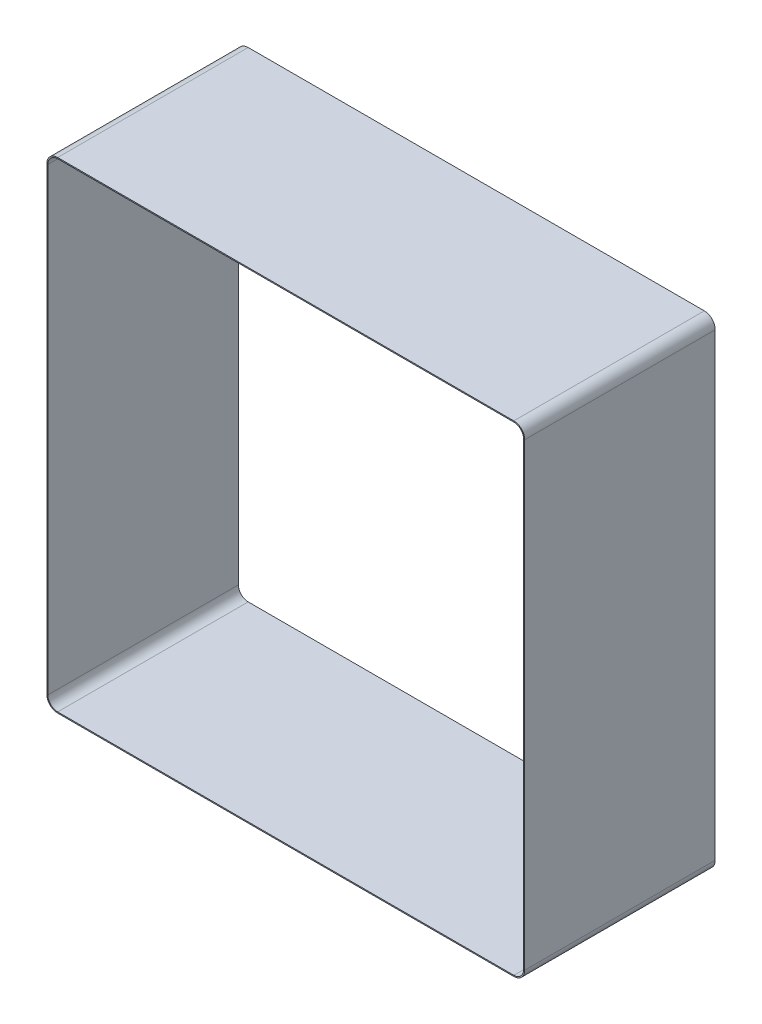
ISO-10303-21;
HEADER;
FILE_DESCRIPTION(('STEP AP214'),'2;1');
FILE_NAME('part.step','',(''),(''),'','','');
FILE_SCHEMA(('AUTOMOTIVE_DESIGN { 1 0 10303 214 1 1 1 1 }'));
ENDSEC;
DATA;
#1=APPLICATION_CONTEXT('core data for automotive mechanical design processes');
#2=APPLICATION_PROTOCOL_DEFINITION('international standard','automotive_design',2000,#1);
#3=PRODUCT_CONTEXT('',#1,'mechanical');
#4=PRODUCT('Part','Part','',(#3));
#5=PRODUCT_RELATED_PRODUCT_CATEGORY('part','',(#4));
#6=PRODUCT_DEFINITION_FORMATION('','',#4);
#7=PRODUCT_DEFINITION_CONTEXT('part definition',#1,'design');
#8=PRODUCT_DEFINITION('design','',#6,#7);
#9=PRODUCT_DEFINITION_SHAPE('','',#8);
#10=(LENGTH_UNIT() NAMED_UNIT(*) SI_UNIT(.MILLI.,.METRE.));
#11=(NAMED_UNIT(*) PLANE_ANGLE_UNIT() SI_UNIT($,.RADIAN.));
#12=(NAMED_UNIT(*) SI_UNIT($,.STERADIAN.) SOLID_ANGLE_UNIT());
#13=UNCERTAINTY_MEASURE_WITH_UNIT(LENGTH_MEASURE(1.E-05),#10,'distance_accuracy_value','');
#14=(GEOMETRIC_REPRESENTATION_CONTEXT(3) GLOBAL_UNCERTAINTY_ASSIGNED_CONTEXT((#13)) GLOBAL_UNIT_ASSIGNED_CONTEXT((#10,
#11,#12)) REPRESENTATION_CONTEXT('',''));
#15=CARTESIAN_POINT('',(0.,0.,0.));
#16=DIRECTION('',(0.,0.,1.));
#17=DIRECTION('',(1.,0.,0.));
#18=AXIS2_PLACEMENT_3D('',#15,#16,#17);
#19=CARTESIAN_POINT('',(-53.213,-53.594,44.45));
#20=DIRECTION('',(0.,0.,1.));
#21=DIRECTION('',(1.,0.,0.));
#22=AXIS2_PLACEMENT_3D('',#19,#20,#21);
#23=PLANE('',#22);
#24=CARTESIAN_POINT('',(-53.213,-53.594,44.45));
#25=DIRECTION('',(0.,0.,1.));
#26=DIRECTION('',(1.,0.,0.));
#27=AXIS2_PLACEMENT_3D('',#24,#25,#26);
#28=CIRCLE('',#27,2.54);
#29=CARTESIAN_POINT('',(-55.753,-53.594,44.45));
#30=VERTEX_POINT('',#29);
#31=CARTESIAN_POINT('',(-53.213,-56.134,44.45));
#32=VERTEX_POINT('',#31);
#33=EDGE_CURVE('E211',#30,#32,#28,.T.);
#34=ORIENTED_EDGE('',*,*,#33,.T.);
#35=DIRECTION('',(1.,0.,0.));
#36=VECTOR('',#35,1.);
#37=CARTESIAN_POINT('',(-53.213,-56.134,44.45));
#38=LINE('',#37,#36);
#39=CARTESIAN_POINT('',(53.213,-56.134,44.45));
#40=VERTEX_POINT('',#39);
#41=EDGE_CURVE('E214',#32,#40,#38,.T.);
#42=ORIENTED_EDGE('',*,*,#41,.T.);
#43=CARTESIAN_POINT('',(53.213,-53.594,44.45));
#44=DIRECTION('',(0.,0.,1.));
#45=DIRECTION('',(-1.,0.,0.));
#46=AXIS2_PLACEMENT_3D('',#43,#44,#45);
#47=CIRCLE('',#46,2.54);
#48=CARTESIAN_POINT('',(55.753,-53.594,44.45));
#49=VERTEX_POINT('',#48);
#50=EDGE_CURVE('E217',#40,#49,#47,.T.);
#51=ORIENTED_EDGE('',*,*,#50,.T.);
#52=DIRECTION('',(0.,1.,0.));
#53=VECTOR('',#52,1.);
#54=CARTESIAN_POINT('',(55.753,53.594,44.45));
#55=LINE('',#54,#53);
#56=CARTESIAN_POINT('',(55.753,53.594,44.45));
#57=VERTEX_POINT('',#56);
#58=EDGE_CURVE('E219',#49,#57,#55,.T.);
#59=ORIENTED_EDGE('',*,*,#58,.T.);
#60=CARTESIAN_POINT('',(53.213,53.594,44.45));
#61=DIRECTION('',(0.,0.,1.));
#62=DIRECTION('',(1.,0.,0.));
#63=AXIS2_PLACEMENT_3D('',#60,#61,#62);
#64=CIRCLE('',#63,2.54);
#65=CARTESIAN_POINT('',(53.213,56.134,44.45));
#66=VERTEX_POINT('',#65);
#67=EDGE_CURVE('E221',#57,#66,#64,.T.);
#68=ORIENTED_EDGE('',*,*,#67,.T.);
#69=DIRECTION('',(-1.,0.,0.));
#70=VECTOR('',#69,1.);
#71=CARTESIAN_POINT('',(-53.213,56.134,44.45));
#72=LINE('',#71,#70);
#73=CARTESIAN_POINT('',(-53.213,56.134,44.45));
#74=VERTEX_POINT('',#73);
#75=EDGE_CURVE('E223',#66,#74,#72,.T.);
#76=ORIENTED_EDGE('',*,*,#75,.T.);
#77=CARTESIAN_POINT('',(-53.213,53.594,44.45));
#78=DIRECTION('',(0.,0.,1.));
#79=DIRECTION('',(1.,0.,0.));
#80=AXIS2_PLACEMENT_3D('',#77,#78,#79);
#81=CIRCLE('',#80,2.54);
#82=CARTESIAN_POINT('',(-55.753,53.594,44.45));
#83=VERTEX_POINT('',#82);
#84=EDGE_CURVE('E225',#74,#83,#81,.T.);
#85=ORIENTED_EDGE('',*,*,#84,.T.);
#86=DIRECTION('',(0.,-1.,0.));
#87=VECTOR('',#86,1.);
#88=CARTESIAN_POINT('',(-55.753,53.594,44.45));
#89=LINE('',#88,#87);
#90=EDGE_CURVE('E227',#83,#30,#89,.T.);
#91=ORIENTED_EDGE('',*,*,#90,.T.);
#92=EDGE_LOOP('',(#34,#42,#51,#59,#68,#76,#85,#91));
#93=FACE_BOUND('',#92,.T.);
#94=DIRECTION('',(0.,-1.,0.));
#95=VECTOR('',#94,1.);
#96=CARTESIAN_POINT('',(-55.499,53.594,44.45));
#97=LINE('',#96,#95);
#98=CARTESIAN_POINT('',(-55.499,53.594,44.45));
#99=VERTEX_POINT('',#98);
#100=CARTESIAN_POINT('',(-55.499,-53.594,44.45));
#101=VERTEX_POINT('',#100);
#102=EDGE_CURVE('E154',#99,#101,#97,.T.);
#103=ORIENTED_EDGE('',*,*,#102,.F.);
#104=CARTESIAN_POINT('',(-53.213,53.594,44.45));
#105=DIRECTION('',(0.,0.,1.));
#106=DIRECTION('',(1.,0.,0.));
#107=AXIS2_PLACEMENT_3D('',#104,#105,#106);
#108=CIRCLE('',#107,2.286);
#109=CARTESIAN_POINT('',(-53.213,55.88,44.45));
#110=VERTEX_POINT('',#109);
#111=EDGE_CURVE('E146',#110,#99,#108,.T.);
#112=ORIENTED_EDGE('',*,*,#111,.F.);
#113=DIRECTION('',(-1.,0.,0.));
#114=VECTOR('',#113,1.);
#115=CARTESIAN_POINT('',(-53.213,55.88,44.45));
#116=LINE('',#115,#114);
#117=CARTESIAN_POINT('',(53.213,55.88,44.45));
#118=VERTEX_POINT('',#117);
#119=EDGE_CURVE('E179',#118,#110,#116,.T.);
#120=ORIENTED_EDGE('',*,*,#119,.F.);
#121=CARTESIAN_POINT('',(53.213,53.594,44.45));
#122=DIRECTION('',(0.,0.,1.));
#123=DIRECTION('',(1.,0.,0.));
#124=AXIS2_PLACEMENT_3D('',#121,#122,#123);
#125=CIRCLE('',#124,2.28600000000001);
#126=CARTESIAN_POINT('',(55.499,53.594,44.45));
#127=VERTEX_POINT('',#126);
#128=EDGE_CURVE('E177',#127,#118,#125,.T.);
#129=ORIENTED_EDGE('',*,*,#128,.F.);
#130=DIRECTION('',(0.,1.,0.));
#131=VECTOR('',#130,1.);
#132=CARTESIAN_POINT('',(55.499,53.594,44.45));
#133=LINE('',#132,#131);
#134=CARTESIAN_POINT('',(55.499,-53.594,44.45));
#135=VERTEX_POINT('',#134);
#136=EDGE_CURVE('E175',#135,#127,#133,.T.);
#137=ORIENTED_EDGE('',*,*,#136,.F.);
#138=CARTESIAN_POINT('',(53.213,-53.594,44.45));
#139=DIRECTION('',(0.,0.,1.));
#140=DIRECTION('',(-1.,0.,0.));
#141=AXIS2_PLACEMENT_3D('',#138,#139,#140);
#142=CIRCLE('',#141,2.286);
#143=CARTESIAN_POINT('',(53.213,-55.88,44.45));
#144=VERTEX_POINT('',#143);
#145=EDGE_CURVE('E173',#144,#135,#142,.T.);
#146=ORIENTED_EDGE('',*,*,#145,.F.);
#147=DIRECTION('',(1.,0.,0.));
#148=VECTOR('',#147,1.);
#149=CARTESIAN_POINT('',(-53.213,-55.88,44.45));
#150=LINE('',#149,#148);
#151=CARTESIAN_POINT('',(-53.213,-55.88,44.45));
#152=VERTEX_POINT('',#151);
#153=EDGE_CURVE('E169',#152,#144,#150,.T.);
#154=ORIENTED_EDGE('',*,*,#153,.F.);
#155=CARTESIAN_POINT('',(-53.213,-53.594,44.45));
#156=DIRECTION('',(0.,0.,1.));
#157=DIRECTION('',(1.,0.,0.));
#158=AXIS2_PLACEMENT_3D('',#155,#156,#157);
#159=CIRCLE('',#158,2.286);
#160=EDGE_CURVE('E167',#101,#152,#159,.T.);
#161=ORIENTED_EDGE('',*,*,#160,.F.);
#162=EDGE_LOOP('',(#103,#112,#120,#129,#137,#146,#154,#161));
#163=FACE_BOUND('',#162,.T.);
#164=ADVANCED_FACE('F33',(#93,#163),#23,.T.);
#165=CARTESIAN_POINT('',(-53.213,-53.594,0.));
#166=DIRECTION('',(0.,0.,1.));
#167=DIRECTION('',(1.,0.,0.));
#168=AXIS2_PLACEMENT_3D('',#165,#166,#167);
#169=PLANE('',#168);
#170=CARTESIAN_POINT('',(-53.213,-53.594,0.));
#171=DIRECTION('',(0.,0.,1.));
#172=DIRECTION('',(1.,0.,0.));
#173=AXIS2_PLACEMENT_3D('',#170,#171,#172);
#174=CIRCLE('',#173,2.54);
#175=CARTESIAN_POINT('',(-55.753,-53.594,0.));
#176=VERTEX_POINT('',#175);
#177=CARTESIAN_POINT('',(-53.213,-56.134,0.));
#178=VERTEX_POINT('',#177);
#179=EDGE_CURVE('E162',#176,#178,#174,.T.);
#180=ORIENTED_EDGE('',*,*,#179,.F.);
#181=DIRECTION('',(0.,-1.,0.));
#182=VECTOR('',#181,1.);
#183=CARTESIAN_POINT('',(-55.753,53.594,0.));
#184=LINE('',#183,#182);
#185=CARTESIAN_POINT('',(-55.753,53.594,0.));
#186=VERTEX_POINT('',#185);
#187=EDGE_CURVE('E215',#186,#176,#184,.T.);
#188=ORIENTED_EDGE('',*,*,#187,.F.);
#189=CARTESIAN_POINT('',(-53.213,53.594,0.));
#190=DIRECTION('',(0.,0.,1.));
#191=DIRECTION('',(1.,0.,0.));
#192=AXIS2_PLACEMENT_3D('',#189,#190,#191);
#193=CIRCLE('',#192,2.54);
#194=CARTESIAN_POINT('',(-53.213,56.134,0.));
#195=VERTEX_POINT('',#194);
#196=EDGE_CURVE('E242',#195,#186,#193,.T.);
#197=ORIENTED_EDGE('',*,*,#196,.F.);
#198=DIRECTION('',(-1.,0.,0.));
#199=VECTOR('',#198,1.);
#200=CARTESIAN_POINT('',(-53.213,56.134,0.));
#201=LINE('',#200,#199);
#202=CARTESIAN_POINT('',(53.213,56.134,0.));
#203=VERTEX_POINT('',#202);
#204=EDGE_CURVE('E240',#203,#195,#201,.T.);
#205=ORIENTED_EDGE('',*,*,#204,.F.);
#206=CARTESIAN_POINT('',(53.213,53.594,0.));
#207=DIRECTION('',(0.,0.,1.));
#208=DIRECTION('',(1.,0.,0.));
#209=AXIS2_PLACEMENT_3D('',#206,#207,#208);
#210=CIRCLE('',#209,2.54);
#211=CARTESIAN_POINT('',(55.753,53.594,0.));
#212=VERTEX_POINT('',#211);
#213=EDGE_CURVE('E238',#212,#203,#210,.T.);
#214=ORIENTED_EDGE('',*,*,#213,.F.);
#215=DIRECTION('',(0.,1.,0.));
#216=VECTOR('',#215,1.);
#217=CARTESIAN_POINT('',(55.753,53.594,0.));
#218=LINE('',#217,#216);
#219=CARTESIAN_POINT('',(55.753,-53.594,0.));
#220=VERTEX_POINT('',#219);
#221=EDGE_CURVE('E236',#220,#212,#218,.T.);
#222=ORIENTED_EDGE('',*,*,#221,.F.);
#223=CARTESIAN_POINT('',(53.213,-53.594,0.));
#224=DIRECTION('',(0.,0.,1.));
#225=DIRECTION('',(-1.,0.,0.));
#226=AXIS2_PLACEMENT_3D('',#223,#224,#225);
#227=CIRCLE('',#226,2.54);
#228=CARTESIAN_POINT('',(53.213,-56.134,0.));
#229=VERTEX_POINT('',#228);
#230=EDGE_CURVE('E234',#229,#220,#227,.T.);
#231=ORIENTED_EDGE('',*,*,#230,.F.);
#232=DIRECTION('',(1.,0.,0.));
#233=VECTOR('',#232,1.);
#234=CARTESIAN_POINT('',(-53.213,-56.134,0.));
#235=LINE('',#234,#233);
#236=EDGE_CURVE('E232',#178,#229,#235,.T.);
#237=ORIENTED_EDGE('',*,*,#236,.F.);
#238=EDGE_LOOP('',(#180,#188,#197,#205,#214,#222,#231,#237));
#239=FACE_BOUND('',#238,.T.);
#240=CARTESIAN_POINT('',(-53.213,53.594,0.));
#241=DIRECTION('',(0.,0.,1.));
#242=DIRECTION('',(1.,0.,0.));
#243=AXIS2_PLACEMENT_3D('',#240,#241,#242);
#244=CIRCLE('',#243,2.286);
#245=CARTESIAN_POINT('',(-53.213,55.88,0.));
#246=VERTEX_POINT('',#245);
#247=CARTESIAN_POINT('',(-55.499,53.594,0.));
#248=VERTEX_POINT('',#247);
#249=EDGE_CURVE('E56',#246,#248,#244,.T.);
#250=ORIENTED_EDGE('',*,*,#249,.T.);
#251=DIRECTION('',(0.,-1.,0.));
#252=VECTOR('',#251,1.);
#253=CARTESIAN_POINT('',(-55.499,53.594,0.));
#254=LINE('',#253,#252);
#255=CARTESIAN_POINT('',(-55.499,-53.594,0.));
#256=VERTEX_POINT('',#255);
#257=EDGE_CURVE('E161',#248,#256,#254,.T.);
#258=ORIENTED_EDGE('',*,*,#257,.T.);
#259=CARTESIAN_POINT('',(-53.213,-53.594,0.));
#260=DIRECTION('',(0.,0.,1.));
#261=DIRECTION('',(1.,0.,0.));
#262=AXIS2_PLACEMENT_3D('',#259,#260,#261);
#263=CIRCLE('',#262,2.286);
#264=CARTESIAN_POINT('',(-53.213,-55.88,0.));
#265=VERTEX_POINT('',#264);
#266=EDGE_CURVE('E183',#256,#265,#263,.T.);
#267=ORIENTED_EDGE('',*,*,#266,.T.);
#268=DIRECTION('',(1.,0.,0.));
#269=VECTOR('',#268,1.);
#270=CARTESIAN_POINT('',(-53.213,-55.88,0.));
#271=LINE('',#270,#269);
#272=CARTESIAN_POINT('',(53.213,-55.88,0.));
#273=VERTEX_POINT('',#272);
#274=EDGE_CURVE('E186',#265,#273,#271,.T.);
#275=ORIENTED_EDGE('',*,*,#274,.T.);
#276=CARTESIAN_POINT('',(53.213,-53.594,0.));
#277=DIRECTION('',(0.,0.,1.));
#278=DIRECTION('',(-1.,0.,0.));
#279=AXIS2_PLACEMENT_3D('',#276,#277,#278);
#280=CIRCLE('',#279,2.286);
#281=CARTESIAN_POINT('',(55.499,-53.594,0.));
#282=VERTEX_POINT('',#281);
#283=EDGE_CURVE('E189',#273,#282,#280,.T.);
#284=ORIENTED_EDGE('',*,*,#283,.T.);
#285=DIRECTION('',(0.,1.,0.));
#286=VECTOR('',#285,1.);
#287=CARTESIAN_POINT('',(55.499,53.594,0.));
#288=LINE('',#287,#286);
#289=CARTESIAN_POINT('',(55.499,53.594,0.));
#290=VERTEX_POINT('',#289);
#291=EDGE_CURVE('E192',#282,#290,#288,.T.);
#292=ORIENTED_EDGE('',*,*,#291,.T.);
#293=CARTESIAN_POINT('',(53.213,53.594,0.));
#294=DIRECTION('',(0.,0.,1.));
#295=DIRECTION('',(1.,0.,0.));
#296=AXIS2_PLACEMENT_3D('',#293,#294,#295);
#297=CIRCLE('',#296,2.28600000000001);
#298=CARTESIAN_POINT('',(53.213,55.88,0.));
#299=VERTEX_POINT('',#298);
#300=EDGE_CURVE('E195',#290,#299,#297,.T.);
#301=ORIENTED_EDGE('',*,*,#300,.T.);
#302=DIRECTION('',(-1.,0.,0.));
#303=VECTOR('',#302,1.);
#304=CARTESIAN_POINT('',(-53.213,55.88,0.));
#305=LINE('',#304,#303);
#306=EDGE_CURVE('E155',#299,#246,#305,.T.);
#307=ORIENTED_EDGE('',*,*,#306,.T.);
#308=EDGE_LOOP('',(#250,#258,#267,#275,#284,#292,#301,#307));
#309=FACE_BOUND('',#308,.T.);
#310=ADVANCED_FACE('F272',(#239,#309),#169,.F.);
#311=CARTESIAN_POINT('',(-53.213,-53.594,44.45));
#312=DIRECTION('',(0.,0.,-1.));
#313=DIRECTION('',(-1.,0.,0.));
#314=AXIS2_PLACEMENT_3D('',#311,#312,#313);
#315=CYLINDRICAL_SURFACE('',#314,2.54);
#316=ORIENTED_EDGE('',*,*,#179,.T.);
#317=DIRECTION('',(0.,0.,-1.));
#318=VECTOR('',#317,1.);
#319=CARTESIAN_POINT('',(-53.213,-56.134,44.45));
#320=LINE('',#319,#318);
#321=EDGE_CURVE('E11',#32,#178,#320,.T.);
#322=ORIENTED_EDGE('',*,*,#321,.F.);
#323=ORIENTED_EDGE('',*,*,#33,.F.);
#324=DIRECTION('',(0.,0.,-1.));
#325=VECTOR('',#324,1.);
#326=CARTESIAN_POINT('',(-55.753,-53.594,44.45));
#327=LINE('',#326,#325);
#328=EDGE_CURVE('E229',#30,#176,#327,.T.);
#329=ORIENTED_EDGE('',*,*,#328,.T.);
#330=EDGE_LOOP('',(#316,#322,#323,#329));
#331=FACE_BOUND('',#330,.T.);
#332=ADVANCED_FACE('F35',(#331),#315,.T.);
#333=CARTESIAN_POINT('',(-53.213,-56.134,44.45));
#334=DIRECTION('',(0.,1.,0.));
#335=DIRECTION('',(0.,0.,1.));
#336=AXIS2_PLACEMENT_3D('',#333,#334,#335);
#337=PLANE('',#336);
#338=ORIENTED_EDGE('',*,*,#236,.T.);
#339=DIRECTION('',(0.,0.,-1.));
#340=VECTOR('',#339,1.);
#341=CARTESIAN_POINT('',(53.213,-56.134,44.45));
#342=LINE('',#341,#340);
#343=EDGE_CURVE('E41',#40,#229,#342,.T.);
#344=ORIENTED_EDGE('',*,*,#343,.F.);
#345=ORIENTED_EDGE('',*,*,#41,.F.);
#346=ORIENTED_EDGE('',*,*,#321,.T.);
#347=EDGE_LOOP('',(#338,#344,#345,#346));
#348=FACE_BOUND('',#347,.T.);
#349=ADVANCED_FACE('F289',(#348),#337,.F.);
#350=CARTESIAN_POINT('',(53.213,-53.594,44.45));
#351=DIRECTION('',(0.,0.,-1.));
#352=DIRECTION('',(-1.,0.,0.));
#353=AXIS2_PLACEMENT_3D('',#350,#351,#352);
#354=CYLINDRICAL_SURFACE('',#353,2.54);
#355=ORIENTED_EDGE('',*,*,#230,.T.);
#356=DIRECTION('',(0.,0.,-1.));
#357=VECTOR('',#356,1.);
#358=CARTESIAN_POINT('',(55.753,-53.594,44.45));
#359=LINE('',#358,#357);
#360=EDGE_CURVE('E259',#49,#220,#359,.T.);
#361=ORIENTED_EDGE('',*,*,#360,.F.);
#362=ORIENTED_EDGE('',*,*,#50,.F.);
#363=ORIENTED_EDGE('',*,*,#343,.T.);
#364=EDGE_LOOP('',(#355,#361,#362,#363));
#365=FACE_BOUND('',#364,.T.);
#366=ADVANCED_FACE('F266',(#365),#354,.T.);
#367=CARTESIAN_POINT('',(55.753,53.594,44.45));
#368=DIRECTION('',(-1.,0.,0.));
#369=DIRECTION('',(0.,-1.,0.));
#370=AXIS2_PLACEMENT_3D('',#367,#368,#369);
#371=PLANE('',#370);
#372=ORIENTED_EDGE('',*,*,#221,.T.);
#373=DIRECTION('',(0.,0.,-1.));
#374=VECTOR('',#373,1.);
#375=CARTESIAN_POINT('',(55.753,53.594,44.45));
#376=LINE('',#375,#374);
#377=EDGE_CURVE('E256',#57,#212,#376,.T.);
#378=ORIENTED_EDGE('',*,*,#377,.F.);
#379=ORIENTED_EDGE('',*,*,#58,.F.);
#380=ORIENTED_EDGE('',*,*,#360,.T.);
#381=EDGE_LOOP('',(#372,#378,#379,#380));
#382=FACE_BOUND('',#381,.T.);
#383=ADVANCED_FACE('F278',(#382),#371,.F.);
#384=CARTESIAN_POINT('',(53.213,53.594,44.45));
#385=DIRECTION('',(0.,0.,-1.));
#386=DIRECTION('',(-1.,0.,0.));
#387=AXIS2_PLACEMENT_3D('',#384,#385,#386);
#388=CYLINDRICAL_SURFACE('',#387,2.54);
#389=ORIENTED_EDGE('',*,*,#213,.T.);
#390=DIRECTION('',(0.,0.,-1.));
#391=VECTOR('',#390,1.);
#392=CARTESIAN_POINT('',(53.213,56.134,44.45));
#393=LINE('',#392,#391);
#394=EDGE_CURVE('E253',#66,#203,#393,.T.);
#395=ORIENTED_EDGE('',*,*,#394,.F.);
#396=ORIENTED_EDGE('',*,*,#67,.F.);
#397=ORIENTED_EDGE('',*,*,#377,.T.);
#398=EDGE_LOOP('',(#389,#395,#396,#397));
#399=FACE_BOUND('',#398,.T.);
#400=ADVANCED_FACE('F282',(#399),#388,.T.);
#401=CARTESIAN_POINT('',(-53.213,56.134,44.45));
#402=DIRECTION('',(0.,-1.,0.));
#403=DIRECTION('',(0.,0.,-1.));
#404=AXIS2_PLACEMENT_3D('',#401,#402,#403);
#405=PLANE('',#404);
#406=ORIENTED_EDGE('',*,*,#204,.T.);
#407=DIRECTION('',(0.,0.,-1.));
#408=VECTOR('',#407,1.);
#409=CARTESIAN_POINT('',(-53.213,56.134,44.45));
#410=LINE('',#409,#408);
#411=EDGE_CURVE('E250',#74,#195,#410,.T.);
#412=ORIENTED_EDGE('',*,*,#411,.F.);
#413=ORIENTED_EDGE('',*,*,#75,.F.);
#414=ORIENTED_EDGE('',*,*,#394,.T.);
#415=EDGE_LOOP('',(#406,#412,#413,#414));
#416=FACE_BOUND('',#415,.T.);
#417=ADVANCED_FACE('F302',(#416),#405,.F.);
#418=CARTESIAN_POINT('',(-53.213,53.594,44.45));
#419=DIRECTION('',(0.,0.,-1.));
#420=DIRECTION('',(-1.,0.,0.));
#421=AXIS2_PLACEMENT_3D('',#418,#419,#420);
#422=CYLINDRICAL_SURFACE('',#421,2.54);
#423=ORIENTED_EDGE('',*,*,#196,.T.);
#424=DIRECTION('',(0.,0.,-1.));
#425=VECTOR('',#424,1.);
#426=CARTESIAN_POINT('',(-55.753,53.594,44.45));
#427=LINE('',#426,#425);
#428=EDGE_CURVE('E247',#83,#186,#427,.T.);
#429=ORIENTED_EDGE('',*,*,#428,.F.);
#430=ORIENTED_EDGE('',*,*,#84,.F.);
#431=ORIENTED_EDGE('',*,*,#411,.T.);
#432=EDGE_LOOP('',(#423,#429,#430,#431));
#433=FACE_BOUND('',#432,.T.);
#434=ADVANCED_FACE('F300',(#433),#422,.T.);
#435=CARTESIAN_POINT('',(-55.753,53.594,44.45));
#436=DIRECTION('',(1.,0.,0.));
#437=DIRECTION('',(0.,1.,0.));
#438=AXIS2_PLACEMENT_3D('',#435,#436,#437);
#439=PLANE('',#438);
#440=ORIENTED_EDGE('',*,*,#187,.T.);
#441=ORIENTED_EDGE('',*,*,#328,.F.);
#442=ORIENTED_EDGE('',*,*,#90,.F.);
#443=ORIENTED_EDGE('',*,*,#428,.T.);
#444=EDGE_LOOP('',(#440,#441,#442,#443));
#445=FACE_BOUND('',#444,.T.);
#446=ADVANCED_FACE('F295',(#445),#439,.F.);
#447=CARTESIAN_POINT('',(-53.213,53.594,44.45));
#448=DIRECTION('',(0.,0.,-1.));
#449=DIRECTION('',(-1.,0.,0.));
#450=AXIS2_PLACEMENT_3D('',#447,#448,#449);
#451=CYLINDRICAL_SURFACE('',#450,2.286);
#452=ORIENTED_EDGE('',*,*,#249,.F.);
#453=DIRECTION('',(0.,0.,-1.));
#454=VECTOR('',#453,1.);
#455=CARTESIAN_POINT('',(-53.213,55.88,44.45));
#456=LINE('',#455,#454);
#457=EDGE_CURVE('E150',#110,#246,#456,.T.);
#458=ORIENTED_EDGE('',*,*,#457,.F.);
#459=ORIENTED_EDGE('',*,*,#111,.T.);
#460=DIRECTION('',(0.,0.,-1.));
#461=VECTOR('',#460,1.);
#462=CARTESIAN_POINT('',(-55.499,53.594,44.45));
#463=LINE('',#462,#461);
#464=EDGE_CURVE('E149',#99,#248,#463,.T.);
#465=ORIENTED_EDGE('',*,*,#464,.T.);
#466=EDGE_LOOP('',(#452,#458,#459,#465));
#467=FACE_BOUND('',#466,.T.);
#468=ADVANCED_FACE('F148',(#467),#451,.F.);
#469=CARTESIAN_POINT('',(-55.499,53.594,44.45));
#470=DIRECTION('',(1.,0.,0.));
#471=DIRECTION('',(0.,1.,0.));
#472=AXIS2_PLACEMENT_3D('',#469,#470,#471);
#473=PLANE('',#472);
#474=ORIENTED_EDGE('',*,*,#257,.F.);
#475=ORIENTED_EDGE('',*,*,#464,.F.);
#476=ORIENTED_EDGE('',*,*,#102,.T.);
#477=DIRECTION('',(0.,0.,-1.));
#478=VECTOR('',#477,1.);
#479=CARTESIAN_POINT('',(-55.499,-53.594,44.45));
#480=LINE('',#479,#478);
#481=EDGE_CURVE('E163',#101,#256,#480,.T.);
#482=ORIENTED_EDGE('',*,*,#481,.T.);
#483=EDGE_LOOP('',(#474,#475,#476,#482));
#484=FACE_BOUND('',#483,.T.);
#485=ADVANCED_FACE('F158',(#484),#473,.T.);
#486=CARTESIAN_POINT('',(-53.213,-53.594,44.45));
#487=DIRECTION('',(0.,0.,-1.));
#488=DIRECTION('',(-1.,0.,0.));
#489=AXIS2_PLACEMENT_3D('',#486,#487,#488);
#490=CYLINDRICAL_SURFACE('',#489,2.286);
#491=ORIENTED_EDGE('',*,*,#266,.F.);
#492=ORIENTED_EDGE('',*,*,#481,.F.);
#493=ORIENTED_EDGE('',*,*,#160,.T.);
#494=DIRECTION('',(0.,0.,-1.));
#495=VECTOR('',#494,1.);
#496=CARTESIAN_POINT('',(-53.213,-55.88,44.45));
#497=LINE('',#496,#495);
#498=EDGE_CURVE('E208',#152,#265,#497,.T.);
#499=ORIENTED_EDGE('',*,*,#498,.T.);
#500=EDGE_LOOP('',(#491,#492,#493,#499));
#501=FACE_BOUND('',#500,.T.);
#502=ADVANCED_FACE('F327',(#501),#490,.F.);
#503=CARTESIAN_POINT('',(-53.213,-55.88,44.45));
#504=DIRECTION('',(0.,1.,0.));
#505=DIRECTION('',(0.,0.,1.));
#506=AXIS2_PLACEMENT_3D('',#503,#504,#505);
#507=PLANE('',#506);
#508=ORIENTED_EDGE('',*,*,#274,.F.);
#509=ORIENTED_EDGE('',*,*,#498,.F.);
#510=ORIENTED_EDGE('',*,*,#153,.T.);
#511=DIRECTION('',(0.,0.,-1.));
#512=VECTOR('',#511,1.);
#513=CARTESIAN_POINT('',(53.213,-55.88,44.45));
#514=LINE('',#513,#512);
#515=EDGE_CURVE('E206',#144,#273,#514,.T.);
#516=ORIENTED_EDGE('',*,*,#515,.T.);
#517=EDGE_LOOP('',(#508,#509,#510,#516));
#518=FACE_BOUND('',#517,.T.);
#519=ADVANCED_FACE('F331',(#518),#507,.T.);
#520=CARTESIAN_POINT('',(53.213,-53.594,44.45));
#521=DIRECTION('',(0.,0.,-1.));
#522=DIRECTION('',(-1.,0.,0.));
#523=AXIS2_PLACEMENT_3D('',#520,#521,#522);
#524=CYLINDRICAL_SURFACE('',#523,2.286);
#525=ORIENTED_EDGE('',*,*,#283,.F.);
#526=ORIENTED_EDGE('',*,*,#515,.F.);
#527=ORIENTED_EDGE('',*,*,#145,.T.);
#528=DIRECTION('',(0.,0.,-1.));
#529=VECTOR('',#528,1.);
#530=CARTESIAN_POINT('',(55.499,-53.594,44.45));
#531=LINE('',#530,#529);
#532=EDGE_CURVE('E204',#135,#282,#531,.T.);
#533=ORIENTED_EDGE('',*,*,#532,.T.);
#534=EDGE_LOOP('',(#525,#526,#527,#533));
#535=FACE_BOUND('',#534,.T.);
#536=ADVANCED_FACE('F337',(#535),#524,.F.);
#537=CARTESIAN_POINT('',(55.499,53.594,44.45));
#538=DIRECTION('',(-1.,0.,0.));
#539=DIRECTION('',(0.,-1.,0.));
#540=AXIS2_PLACEMENT_3D('',#537,#538,#539);
#541=PLANE('',#540);
#542=ORIENTED_EDGE('',*,*,#291,.F.);
#543=ORIENTED_EDGE('',*,*,#532,.F.);
#544=ORIENTED_EDGE('',*,*,#136,.T.);
#545=DIRECTION('',(0.,0.,-1.));
#546=VECTOR('',#545,1.);
#547=CARTESIAN_POINT('',(55.499,53.594,44.45));
#548=LINE('',#547,#546);
#549=EDGE_CURVE('E202',#127,#290,#548,.T.);
#550=ORIENTED_EDGE('',*,*,#549,.T.);
#551=EDGE_LOOP('',(#542,#543,#544,#550));
#552=FACE_BOUND('',#551,.T.);
#553=ADVANCED_FACE('F341',(#552),#541,.T.);
#554=CARTESIAN_POINT('',(53.213,53.594,44.45));
#555=DIRECTION('',(0.,0.,-1.));
#556=DIRECTION('',(-1.,0.,0.));
#557=AXIS2_PLACEMENT_3D('',#554,#555,#556);
#558=CYLINDRICAL_SURFACE('',#557,2.28600000000001);
#559=ORIENTED_EDGE('',*,*,#300,.F.);
#560=ORIENTED_EDGE('',*,*,#549,.F.);
#561=ORIENTED_EDGE('',*,*,#128,.T.);
#562=DIRECTION('',(0.,0.,-1.));
#563=VECTOR('',#562,1.);
#564=CARTESIAN_POINT('',(53.213,55.88,44.45));
#565=LINE('',#564,#563);
#566=EDGE_CURVE('E48',#118,#299,#565,.T.);
#567=ORIENTED_EDGE('',*,*,#566,.T.);
#568=EDGE_LOOP('',(#559,#560,#561,#567));
#569=FACE_BOUND('',#568,.T.);
#570=ADVANCED_FACE('F345',(#569),#558,.F.);
#571=CARTESIAN_POINT('',(-53.213,55.88,44.45));
#572=DIRECTION('',(0.,-1.,0.));
#573=DIRECTION('',(0.,0.,-1.));
#574=AXIS2_PLACEMENT_3D('',#571,#572,#573);
#575=PLANE('',#574);
#576=ORIENTED_EDGE('',*,*,#306,.F.);
#577=ORIENTED_EDGE('',*,*,#566,.F.);
#578=ORIENTED_EDGE('',*,*,#119,.T.);
#579=ORIENTED_EDGE('',*,*,#457,.T.);
#580=EDGE_LOOP('',(#576,#577,#578,#579));
#581=FACE_BOUND('',#580,.T.);
#582=ADVANCED_FACE('F349',(#581),#575,.T.);
#583=CLOSED_SHELL('',(#164,#310,#332,#349,#366,#383,#400,#417,#434,#446,#468,#485,#502,#519,
#536,#553,#570,#582));
#584=MANIFOLD_SOLID_BREP('B2',#583);
#585=ADVANCED_BREP_SHAPE_REPRESENTATION('',(#18,#584),#14);
#586=SHAPE_DEFINITION_REPRESENTATION(#9,#585);
ENDSEC;
END-ISO-10303-21;
